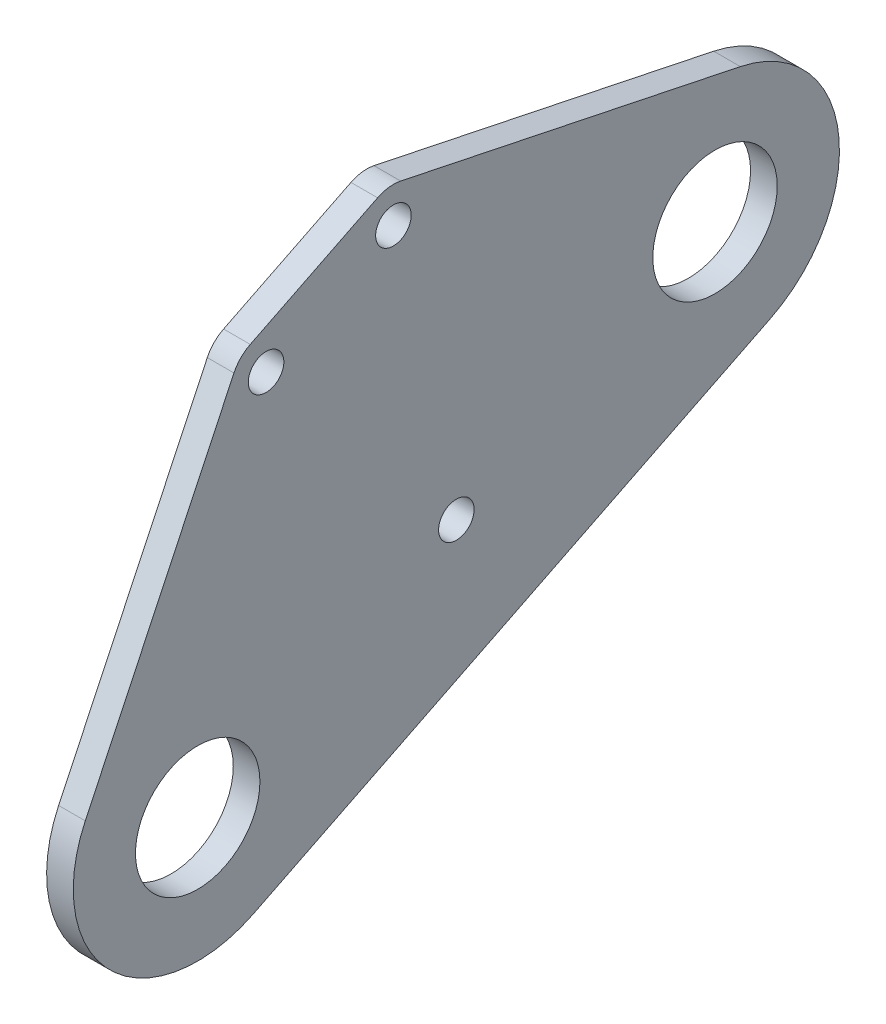
ISO-10303-21;
HEADER;
FILE_DESCRIPTION(('STEP AP214'),'2;1');
FILE_NAME('part.step','',(''),(''),'','','');
FILE_SCHEMA(('AUTOMOTIVE_DESIGN { 1 0 10303 214 1 1 1 1 }'));
ENDSEC;
DATA;
#1=APPLICATION_CONTEXT('core data for automotive mechanical design processes');
#2=APPLICATION_PROTOCOL_DEFINITION('international standard','automotive_design',2000,#1);
#3=PRODUCT_CONTEXT('',#1,'mechanical');
#4=PRODUCT('Part','Part','',(#3));
#5=PRODUCT_RELATED_PRODUCT_CATEGORY('part','',(#4));
#6=PRODUCT_DEFINITION_FORMATION('','',#4);
#7=PRODUCT_DEFINITION_CONTEXT('part definition',#1,'design');
#8=PRODUCT_DEFINITION('design','',#6,#7);
#9=PRODUCT_DEFINITION_SHAPE('','',#8);
#10=(LENGTH_UNIT() NAMED_UNIT(*) SI_UNIT(.MILLI.,.METRE.));
#11=(NAMED_UNIT(*) PLANE_ANGLE_UNIT() SI_UNIT($,.RADIAN.));
#12=(NAMED_UNIT(*) SI_UNIT($,.STERADIAN.) SOLID_ANGLE_UNIT());
#13=UNCERTAINTY_MEASURE_WITH_UNIT(LENGTH_MEASURE(1.E-05),#10,'distance_accuracy_value','');
#14=(GEOMETRIC_REPRESENTATION_CONTEXT(3) GLOBAL_UNCERTAINTY_ASSIGNED_CONTEXT((#13)) GLOBAL_UNIT_ASSIGNED_CONTEXT((#10,
#11,#12)) REPRESENTATION_CONTEXT('',''));
#15=CARTESIAN_POINT('',(0.,0.,0.));
#16=DIRECTION('',(0.,0.,1.));
#17=DIRECTION('',(1.,0.,0.));
#18=AXIS2_PLACEMENT_3D('',#15,#16,#17);
#19=CARTESIAN_POINT('',(3.,180.,382.2));
#20=DIRECTION('',(1.,0.,0.));
#21=DIRECTION('',(0.,0.,-1.));
#22=AXIS2_PLACEMENT_3D('',#19,#20,#21);
#23=PLANE('',#22);
#24=CARTESIAN_POINT('',(3.,197.747726212406,418.383811494776));
#25=DIRECTION('',(1.,0.,0.));
#26=DIRECTION('',(0.,0.,1.));
#27=AXIS2_PLACEMENT_3D('',#24,#25,#26);
#28=CIRCLE('',#27,1.99999999999982);
#29=CARTESIAN_POINT('',(3.,197.747726212406,420.383811494776));
#30=VERTEX_POINT('',#29);
#31=EDGE_CURVE('E204',#30,#30,#28,.T.);
#32=ORIENTED_EDGE('',*,*,#31,.F.);
#33=EDGE_LOOP('',(#32));
#34=FACE_BOUND('',#33,.T.);
#35=CARTESIAN_POINT('',(3.,180.,382.2));
#36=DIRECTION('',(1.,0.,0.));
#37=DIRECTION('',(0.,0.,-1.));
#38=AXIS2_PLACEMENT_3D('',#35,#36,#37);
#39=CIRCLE('',#38,6.99999999999993);
#40=CARTESIAN_POINT('',(3.,180.,375.2));
#41=VERTEX_POINT('',#40);
#42=EDGE_CURVE('E192',#41,#41,#39,.T.);
#43=ORIENTED_EDGE('',*,*,#42,.F.);
#44=EDGE_LOOP('',(#43));
#45=FACE_BOUND('',#44,.T.);
#46=CARTESIAN_POINT('',(3.,180.,382.2));
#47=DIRECTION('',(1.,0.,0.));
#48=DIRECTION('',(0.,0.,-1.));
#49=AXIS2_PLACEMENT_3D('',#46,#47,#48);
#50=CIRCLE('',#49,14.);
#51=CARTESIAN_POINT('',(3.,167.463734840162,375.967660484036));
#52=VERTEX_POINT('',#51);
#53=CARTESIAN_POINT('',(3.,193.706103559218,379.346453921174));
#54=VERTEX_POINT('',#53);
#55=EDGE_CURVE('E155',#52,#54,#50,.T.);
#56=ORIENTED_EDGE('',*,*,#55,.T.);
#57=DIRECTION('',(0.,0.203824719916136,0.979007397087023));
#58=VECTOR('',#57,1.);
#59=CARTESIAN_POINT('',(3.,201.663755800754,417.568512615111));
#60=LINE('',#59,#58);
#61=CARTESIAN_POINT('',(3.,201.663755800754,417.568512615111));
#62=VERTEX_POINT('',#61);
#63=EDGE_CURVE('E103',#54,#62,#60,.T.);
#64=ORIENTED_EDGE('',*,*,#63,.T.);
#65=CARTESIAN_POINT('',(3.,197.747726212406,418.383811494776));
#66=DIRECTION('',(1.,0.,0.));
#67=DIRECTION('',(0.,0.,-1.));
#68=AXIS2_PLACEMENT_3D('',#65,#66,#67);
#69=CIRCLE('',#68,3.99999999999999);
#70=CARTESIAN_POINT('',(3.,201.329516258074,420.164479927908));
#71=VERTEX_POINT('',#70);
#72=EDGE_CURVE('E170',#62,#71,#69,.T.);
#73=ORIENTED_EDGE('',*,*,#72,.T.);
#74=DIRECTION('',(0.,-0.445167108283126,0.895447511416967));
#75=VECTOR('',#74,1.);
#76=CARTESIAN_POINT('',(3.,194.206842525544,434.49164011058));
#77=LINE('',#76,#75);
#78=CARTESIAN_POINT('',(3.,194.206842525544,434.49164011058));
#79=VERTEX_POINT('',#78);
#80=EDGE_CURVE('E183',#71,#79,#77,.T.);
#81=ORIENTED_EDGE('',*,*,#80,.T.);
#82=CARTESIAN_POINT('',(3.,190.625052479876,432.710971677447));
#83=DIRECTION('',(1.,0.,0.));
#84=DIRECTION('',(0.,0.,-1.));
#85=AXIS2_PLACEMENT_3D('',#82,#83,#84);
#86=CIRCLE('',#85,3.99999999999999);
#87=CARTESIAN_POINT('',(3.,192.338978455997,436.325173905931));
#88=VERTEX_POINT('',#87);
#89=EDGE_CURVE('E122',#79,#88,#86,.T.);
#90=ORIENTED_EDGE('',*,*,#89,.T.);
#91=DIRECTION('',(0.,-0.903550557121012,0.42848149403015));
#92=VECTOR('',#91,1.);
#93=CARTESIAN_POINT('',(3.,192.338978455997,436.325173905931));
#94=LINE('',#93,#92);
#95=CARTESIAN_POINT('',(3.,157.062878878019,453.053796041797));
#96=VERTEX_POINT('',#95);
#97=EDGE_CURVE('E116',#88,#96,#94,.T.);
#98=ORIENTED_EDGE('',*,*,#97,.T.);
#99=CARTESIAN_POINT('',(3.,151.064137961596,440.404088242103));
#100=DIRECTION('',(1.,0.,0.));
#101=DIRECTION('',(0.,0.,-1.));
#102=AXIS2_PLACEMENT_3D('',#99,#100,#101);
#103=CIRCLE('',#102,14.0000000000001);
#104=CARTESIAN_POINT('',(3.,138.527872801759,434.171748726139));
#105=VERTEX_POINT('',#104);
#106=EDGE_CURVE('E120',#96,#105,#103,.T.);
#107=ORIENTED_EDGE('',*,*,#106,.T.);
#108=DIRECTION('',(0.,0.445167108283131,-0.895447511416965));
#109=VECTOR('',#108,1.);
#110=CARTESIAN_POINT('',(3.,167.463734840162,375.967660484036));
#111=LINE('',#110,#109);
#112=EDGE_CURVE('E60',#105,#52,#111,.T.);
#113=ORIENTED_EDGE('',*,*,#112,.T.);
#114=EDGE_LOOP('',(#56,#64,#73,#81,#90,#98,#107,#113));
#115=FACE_BOUND('',#114,.T.);
#116=CARTESIAN_POINT('',(3.,190.625052479876,432.710971677447));
#117=DIRECTION('',(1.,0.,0.));
#118=DIRECTION('',(0.,0.,-1.));
#119=AXIS2_PLACEMENT_3D('',#116,#117,#118);
#120=CIRCLE('',#119,1.99999999999982);
#121=CARTESIAN_POINT('',(3.,190.625052479876,430.710971677447));
#122=VERTEX_POINT('',#121);
#123=EDGE_CURVE('E144',#122,#122,#120,.T.);
#124=ORIENTED_EDGE('',*,*,#123,.F.);
#125=EDGE_LOOP('',(#124));
#126=FACE_BOUND('',#125,.T.);
#127=CARTESIAN_POINT('',(3.,151.064137961596,440.404088242103));
#128=DIRECTION('',(1.,0.,0.));
#129=DIRECTION('',(0.,0.,-1.));
#130=AXIS2_PLACEMENT_3D('',#127,#128,#129);
#131=CIRCLE('',#130,6.99999999999993);
#132=CARTESIAN_POINT('',(3.,151.064137961596,433.404088242103));
#133=VERTEX_POINT('',#132);
#134=EDGE_CURVE('E198',#133,#133,#131,.T.);
#135=ORIENTED_EDGE('',*,*,#134,.F.);
#136=EDGE_LOOP('',(#135));
#137=FACE_BOUND('',#136,.T.);
#138=CARTESIAN_POINT('',(3.,165.532068980798,411.302044121051));
#139=DIRECTION('',(1.,0.,0.));
#140=DIRECTION('',(0.,0.,-1.));
#141=AXIS2_PLACEMENT_3D('',#138,#139,#140);
#142=CIRCLE('',#141,1.99999999999982);
#143=CARTESIAN_POINT('',(3.,165.532068980798,409.302044121052));
#144=VERTEX_POINT('',#143);
#145=EDGE_CURVE('E210',#144,#144,#142,.T.);
#146=ORIENTED_EDGE('',*,*,#145,.F.);
#147=EDGE_LOOP('',(#146));
#148=FACE_BOUND('',#147,.T.);
#149=ADVANCED_FACE('F43',(#34,#45,#115,#126,#137,#148),#23,.T.);
#150=CARTESIAN_POINT('',(0.,180.,382.2));
#151=DIRECTION('',(1.,0.,0.));
#152=DIRECTION('',(0.,0.,-1.));
#153=AXIS2_PLACEMENT_3D('',#150,#151,#152);
#154=PLANE('',#153);
#155=CARTESIAN_POINT('',(0.,180.,382.2));
#156=DIRECTION('',(1.,0.,0.));
#157=DIRECTION('',(0.,0.,-1.));
#158=AXIS2_PLACEMENT_3D('',#155,#156,#157);
#159=CIRCLE('',#158,14.);
#160=CARTESIAN_POINT('',(0.,167.463734840162,375.967660484036));
#161=VERTEX_POINT('',#160);
#162=CARTESIAN_POINT('',(0.,193.706103559218,379.346453921174));
#163=VERTEX_POINT('',#162);
#164=EDGE_CURVE('E140',#161,#163,#159,.T.);
#165=ORIENTED_EDGE('',*,*,#164,.F.);
#166=DIRECTION('',(0.,0.445167108283131,-0.895447511416965));
#167=VECTOR('',#166,1.);
#168=CARTESIAN_POINT('',(0.,167.463734840162,375.967660484036));
#169=LINE('',#168,#167);
#170=CARTESIAN_POINT('',(0.,138.527872801759,434.171748726139));
#171=VERTEX_POINT('',#170);
#172=EDGE_CURVE('E95',#171,#161,#169,.T.);
#173=ORIENTED_EDGE('',*,*,#172,.F.);
#174=CARTESIAN_POINT('',(0.,151.064137961596,440.404088242103));
#175=DIRECTION('',(1.,0.,0.));
#176=DIRECTION('',(0.,0.,-1.));
#177=AXIS2_PLACEMENT_3D('',#174,#175,#176);
#178=CIRCLE('',#177,14.0000000000001);
#179=CARTESIAN_POINT('',(0.,157.062878878019,453.053796041797));
#180=VERTEX_POINT('',#179);
#181=EDGE_CURVE('E89',#180,#171,#178,.T.);
#182=ORIENTED_EDGE('',*,*,#181,.F.);
#183=DIRECTION('',(0.,-0.903550557121012,0.42848149403015));
#184=VECTOR('',#183,1.);
#185=CARTESIAN_POINT('',(0.,192.338978455997,436.325173905931));
#186=LINE('',#185,#184);
#187=CARTESIAN_POINT('',(0.,192.338978455997,436.325173905931));
#188=VERTEX_POINT('',#187);
#189=EDGE_CURVE('E130',#188,#180,#186,.T.);
#190=ORIENTED_EDGE('',*,*,#189,.F.);
#191=CARTESIAN_POINT('',(0.,190.625052479876,432.710971677447));
#192=DIRECTION('',(1.,0.,0.));
#193=DIRECTION('',(0.,0.,-1.));
#194=AXIS2_PLACEMENT_3D('',#191,#192,#193);
#195=CIRCLE('',#194,3.99999999999999);
#196=CARTESIAN_POINT('',(0.,194.206842525544,434.49164011058));
#197=VERTEX_POINT('',#196);
#198=EDGE_CURVE('E150',#197,#188,#195,.T.);
#199=ORIENTED_EDGE('',*,*,#198,.F.);
#200=DIRECTION('',(0.,-0.445167108283126,0.895447511416967));
#201=VECTOR('',#200,1.);
#202=CARTESIAN_POINT('',(0.,194.206842525544,434.49164011058));
#203=LINE('',#202,#201);
#204=CARTESIAN_POINT('',(0.,201.329516258074,420.164479927908));
#205=VERTEX_POINT('',#204);
#206=EDGE_CURVE('E148',#205,#197,#203,.T.);
#207=ORIENTED_EDGE('',*,*,#206,.F.);
#208=CARTESIAN_POINT('',(0.,197.747726212406,418.383811494776));
#209=DIRECTION('',(1.,0.,0.));
#210=DIRECTION('',(0.,0.,-1.));
#211=AXIS2_PLACEMENT_3D('',#208,#209,#210);
#212=CIRCLE('',#211,3.99999999999999);
#213=CARTESIAN_POINT('',(0.,201.663755800754,417.568512615111));
#214=VERTEX_POINT('',#213);
#215=EDGE_CURVE('E146',#214,#205,#212,.T.);
#216=ORIENTED_EDGE('',*,*,#215,.F.);
#217=DIRECTION('',(0.,0.203824719916136,0.979007397087023));
#218=VECTOR('',#217,1.);
#219=CARTESIAN_POINT('',(0.,201.663755800754,417.568512615111));
#220=LINE('',#219,#218);
#221=EDGE_CURVE('E143',#163,#214,#220,.T.);
#222=ORIENTED_EDGE('',*,*,#221,.F.);
#223=EDGE_LOOP('',(#165,#173,#182,#190,#199,#207,#216,#222));
#224=FACE_BOUND('',#223,.T.);
#225=CARTESIAN_POINT('',(0.,190.625052479876,432.710971677447));
#226=DIRECTION('',(1.,0.,0.));
#227=DIRECTION('',(0.,0.,-1.));
#228=AXIS2_PLACEMENT_3D('',#225,#226,#227);
#229=CIRCLE('',#228,1.99999999999982);
#230=CARTESIAN_POINT('',(0.,190.625052479876,430.710971677447));
#231=VERTEX_POINT('',#230);
#232=EDGE_CURVE('E189',#231,#231,#229,.T.);
#233=ORIENTED_EDGE('',*,*,#232,.T.);
#234=EDGE_LOOP('',(#233));
#235=FACE_BOUND('',#234,.T.);
#236=CARTESIAN_POINT('',(0.,180.,382.2));
#237=DIRECTION('',(1.,0.,0.));
#238=DIRECTION('',(0.,0.,-1.));
#239=AXIS2_PLACEMENT_3D('',#236,#237,#238);
#240=CIRCLE('',#239,6.99999999999993);
#241=CARTESIAN_POINT('',(0.,180.,375.2));
#242=VERTEX_POINT('',#241);
#243=EDGE_CURVE('E195',#242,#242,#240,.T.);
#244=ORIENTED_EDGE('',*,*,#243,.T.);
#245=EDGE_LOOP('',(#244));
#246=FACE_BOUND('',#245,.T.);
#247=CARTESIAN_POINT('',(0.,151.064137961596,440.404088242103));
#248=DIRECTION('',(1.,0.,0.));
#249=DIRECTION('',(0.,0.,-1.));
#250=AXIS2_PLACEMENT_3D('',#247,#248,#249);
#251=CIRCLE('',#250,6.99999999999993);
#252=CARTESIAN_POINT('',(0.,151.064137961596,433.404088242103));
#253=VERTEX_POINT('',#252);
#254=EDGE_CURVE('E201',#253,#253,#251,.T.);
#255=ORIENTED_EDGE('',*,*,#254,.T.);
#256=EDGE_LOOP('',(#255));
#257=FACE_BOUND('',#256,.T.);
#258=CARTESIAN_POINT('',(0.,197.747726212406,418.383811494776));
#259=DIRECTION('',(1.,0.,0.));
#260=DIRECTION('',(0.,0.,1.));
#261=AXIS2_PLACEMENT_3D('',#258,#259,#260);
#262=CIRCLE('',#261,1.99999999999982);
#263=CARTESIAN_POINT('',(0.,197.747726212406,420.383811494776));
#264=VERTEX_POINT('',#263);
#265=EDGE_CURVE('E207',#264,#264,#262,.T.);
#266=ORIENTED_EDGE('',*,*,#265,.T.);
#267=EDGE_LOOP('',(#266));
#268=FACE_BOUND('',#267,.T.);
#269=CARTESIAN_POINT('',(0.,165.532068980798,411.302044121051));
#270=DIRECTION('',(1.,0.,0.));
#271=DIRECTION('',(0.,0.,-1.));
#272=AXIS2_PLACEMENT_3D('',#269,#270,#271);
#273=CIRCLE('',#272,1.99999999999982);
#274=CARTESIAN_POINT('',(0.,165.532068980798,409.302044121052));
#275=VERTEX_POINT('',#274);
#276=EDGE_CURVE('E213',#275,#275,#273,.T.);
#277=ORIENTED_EDGE('',*,*,#276,.T.);
#278=EDGE_LOOP('',(#277));
#279=FACE_BOUND('',#278,.T.);
#280=ADVANCED_FACE('F174',(#224,#235,#246,#257,#268,#279),#154,.F.);
#281=CARTESIAN_POINT('',(3.,180.,382.2));
#282=DIRECTION('',(-1.,0.,0.));
#283=DIRECTION('',(0.,0.,1.));
#284=AXIS2_PLACEMENT_3D('',#281,#282,#283);
#285=CYLINDRICAL_SURFACE('',#284,14.);
#286=ORIENTED_EDGE('',*,*,#164,.T.);
#287=DIRECTION('',(-1.,0.,0.));
#288=VECTOR('',#287,1.);
#289=CARTESIAN_POINT('',(3.,193.706103559218,379.346453921174));
#290=LINE('',#289,#288);
#291=EDGE_CURVE('E11',#54,#163,#290,.T.);
#292=ORIENTED_EDGE('',*,*,#291,.F.);
#293=ORIENTED_EDGE('',*,*,#55,.F.);
#294=DIRECTION('',(-1.,0.,0.));
#295=VECTOR('',#294,1.);
#296=CARTESIAN_POINT('',(3.,167.463734840162,375.967660484036));
#297=LINE('',#296,#295);
#298=EDGE_CURVE('E136',#52,#161,#297,.T.);
#299=ORIENTED_EDGE('',*,*,#298,.T.);
#300=EDGE_LOOP('',(#286,#292,#293,#299));
#301=FACE_BOUND('',#300,.T.);
#302=ADVANCED_FACE('F45',(#301),#285,.T.);
#303=CARTESIAN_POINT('',(3.,201.663755800754,417.568512615111));
#304=DIRECTION('',(0.,-0.979007397087023,0.203824719916136));
#305=DIRECTION('',(0.,-0.203824719916136,-0.979007397087023));
#306=AXIS2_PLACEMENT_3D('',#303,#304,#305);
#307=PLANE('',#306);
#308=ORIENTED_EDGE('',*,*,#221,.T.);
#309=DIRECTION('',(-1.,0.,0.));
#310=VECTOR('',#309,1.);
#311=CARTESIAN_POINT('',(3.,201.663755800754,417.568512615111));
#312=LINE('',#311,#310);
#313=EDGE_CURVE('E52',#62,#214,#312,.T.);
#314=ORIENTED_EDGE('',*,*,#313,.F.);
#315=ORIENTED_EDGE('',*,*,#63,.F.);
#316=ORIENTED_EDGE('',*,*,#291,.T.);
#317=EDGE_LOOP('',(#308,#314,#315,#316));
#318=FACE_BOUND('',#317,.T.);
#319=ADVANCED_FACE('F247',(#318),#307,.F.);
#320=CARTESIAN_POINT('',(3.,197.747726212406,418.383811494776));
#321=DIRECTION('',(-1.,0.,0.));
#322=DIRECTION('',(0.,0.,1.));
#323=AXIS2_PLACEMENT_3D('',#320,#321,#322);
#324=CYLINDRICAL_SURFACE('',#323,3.99999999999999);
#325=ORIENTED_EDGE('',*,*,#215,.T.);
#326=DIRECTION('',(-1.,0.,0.));
#327=VECTOR('',#326,1.);
#328=CARTESIAN_POINT('',(3.,201.329516258074,420.164479927908));
#329=LINE('',#328,#327);
#330=EDGE_CURVE('E162',#71,#205,#329,.T.);
#331=ORIENTED_EDGE('',*,*,#330,.F.);
#332=ORIENTED_EDGE('',*,*,#72,.F.);
#333=ORIENTED_EDGE('',*,*,#313,.T.);
#334=EDGE_LOOP('',(#325,#331,#332,#333));
#335=FACE_BOUND('',#334,.T.);
#336=ADVANCED_FACE('F168',(#335),#324,.T.);
#337=CARTESIAN_POINT('',(3.,194.206842525544,434.49164011058));
#338=DIRECTION('',(0.,-0.895447511416967,-0.445167108283126));
#339=DIRECTION('',(0.,0.445167108283126,-0.895447511416967));
#340=AXIS2_PLACEMENT_3D('',#337,#338,#339);
#341=PLANE('',#340);
#342=ORIENTED_EDGE('',*,*,#206,.T.);
#343=DIRECTION('',(-1.,0.,0.));
#344=VECTOR('',#343,1.);
#345=CARTESIAN_POINT('',(3.,194.206842525544,434.49164011058));
#346=LINE('',#345,#344);
#347=EDGE_CURVE('E159',#79,#197,#346,.T.);
#348=ORIENTED_EDGE('',*,*,#347,.F.);
#349=ORIENTED_EDGE('',*,*,#80,.F.);
#350=ORIENTED_EDGE('',*,*,#330,.T.);
#351=EDGE_LOOP('',(#342,#348,#349,#350));
#352=FACE_BOUND('',#351,.T.);
#353=ADVANCED_FACE('F179',(#352),#341,.F.);
#354=CARTESIAN_POINT('',(3.,190.625052479876,432.710971677447));
#355=DIRECTION('',(-1.,0.,0.));
#356=DIRECTION('',(0.,0.,1.));
#357=AXIS2_PLACEMENT_3D('',#354,#355,#356);
#358=CYLINDRICAL_SURFACE('',#357,3.99999999999999);
#359=ORIENTED_EDGE('',*,*,#198,.T.);
#360=DIRECTION('',(-1.,0.,0.));
#361=VECTOR('',#360,1.);
#362=CARTESIAN_POINT('',(3.,192.338978455997,436.325173905931));
#363=LINE('',#362,#361);
#364=EDGE_CURVE('E131',#88,#188,#363,.T.);
#365=ORIENTED_EDGE('',*,*,#364,.F.);
#366=ORIENTED_EDGE('',*,*,#89,.F.);
#367=ORIENTED_EDGE('',*,*,#347,.T.);
#368=EDGE_LOOP('',(#359,#365,#366,#367));
#369=FACE_BOUND('',#368,.T.);
#370=ADVANCED_FACE('F182',(#369),#358,.T.);
#371=CARTESIAN_POINT('',(3.,192.338978455997,436.325173905931));
#372=DIRECTION('',(0.,-0.42848149403015,-0.903550557121012));
#373=DIRECTION('',(0.,0.903550557121012,-0.42848149403015));
#374=AXIS2_PLACEMENT_3D('',#371,#372,#373);
#375=PLANE('',#374);
#376=ORIENTED_EDGE('',*,*,#189,.T.);
#377=DIRECTION('',(-1.,0.,0.));
#378=VECTOR('',#377,1.);
#379=CARTESIAN_POINT('',(3.,157.062878878019,453.053796041797));
#380=LINE('',#379,#378);
#381=EDGE_CURVE('E127',#96,#180,#380,.T.);
#382=ORIENTED_EDGE('',*,*,#381,.F.);
#383=ORIENTED_EDGE('',*,*,#97,.F.);
#384=ORIENTED_EDGE('',*,*,#364,.T.);
#385=EDGE_LOOP('',(#376,#382,#383,#384));
#386=FACE_BOUND('',#385,.T.);
#387=ADVANCED_FACE('F128',(#386),#375,.F.);
#388=CARTESIAN_POINT('',(3.,151.064137961596,440.404088242103));
#389=DIRECTION('',(-1.,0.,0.));
#390=DIRECTION('',(0.,0.,1.));
#391=AXIS2_PLACEMENT_3D('',#388,#389,#390);
#392=CYLINDRICAL_SURFACE('',#391,14.0000000000001);
#393=ORIENTED_EDGE('',*,*,#181,.T.);
#394=DIRECTION('',(-1.,0.,0.));
#395=VECTOR('',#394,1.);
#396=CARTESIAN_POINT('',(3.,138.527872801759,434.171748726139));
#397=LINE('',#396,#395);
#398=EDGE_CURVE('E132',#105,#171,#397,.T.);
#399=ORIENTED_EDGE('',*,*,#398,.F.);
#400=ORIENTED_EDGE('',*,*,#106,.F.);
#401=ORIENTED_EDGE('',*,*,#381,.T.);
#402=EDGE_LOOP('',(#393,#399,#400,#401));
#403=FACE_BOUND('',#402,.T.);
#404=ADVANCED_FACE('F134',(#403),#392,.T.);
#405=CARTESIAN_POINT('',(3.,167.463734840162,375.967660484036));
#406=DIRECTION('',(0.,0.895447511416965,0.44516710828313));
#407=DIRECTION('',(0.,-0.445167108283131,0.895447511416965));
#408=AXIS2_PLACEMENT_3D('',#405,#406,#407);
#409=PLANE('',#408);
#410=ORIENTED_EDGE('',*,*,#172,.T.);
#411=ORIENTED_EDGE('',*,*,#298,.F.);
#412=ORIENTED_EDGE('',*,*,#112,.F.);
#413=ORIENTED_EDGE('',*,*,#398,.T.);
#414=EDGE_LOOP('',(#410,#411,#412,#413));
#415=FACE_BOUND('',#414,.T.);
#416=ADVANCED_FACE('F235',(#415),#409,.F.);
#417=CARTESIAN_POINT('',(3.,190.625052479876,432.710971677447));
#418=DIRECTION('',(-1.,0.,0.));
#419=DIRECTION('',(0.,0.,1.));
#420=AXIS2_PLACEMENT_3D('',#417,#418,#419);
#421=CYLINDRICAL_SURFACE('',#420,1.99999999999982);
#422=ORIENTED_EDGE('',*,*,#123,.T.);
#423=EDGE_LOOP('',(#422));
#424=FACE_BOUND('',#423,.T.);
#425=ORIENTED_EDGE('',*,*,#232,.F.);
#426=EDGE_LOOP('',(#425));
#427=FACE_BOUND('',#426,.T.);
#428=ADVANCED_FACE('F232',(#424,#427),#421,.F.);
#429=CARTESIAN_POINT('',(3.,180.,382.2));
#430=DIRECTION('',(-1.,0.,0.));
#431=DIRECTION('',(0.,0.,1.));
#432=AXIS2_PLACEMENT_3D('',#429,#430,#431);
#433=CYLINDRICAL_SURFACE('',#432,6.99999999999993);
#434=ORIENTED_EDGE('',*,*,#42,.T.);
#435=EDGE_LOOP('',(#434));
#436=FACE_BOUND('',#435,.T.);
#437=ORIENTED_EDGE('',*,*,#243,.F.);
#438=EDGE_LOOP('',(#437));
#439=FACE_BOUND('',#438,.T.);
#440=ADVANCED_FACE('F314',(#436,#439),#433,.F.);
#441=CARTESIAN_POINT('',(3.,151.064137961596,440.404088242103));
#442=DIRECTION('',(-1.,0.,0.));
#443=DIRECTION('',(0.,0.,1.));
#444=AXIS2_PLACEMENT_3D('',#441,#442,#443);
#445=CYLINDRICAL_SURFACE('',#444,6.99999999999993);
#446=ORIENTED_EDGE('',*,*,#134,.T.);
#447=EDGE_LOOP('',(#446));
#448=FACE_BOUND('',#447,.T.);
#449=ORIENTED_EDGE('',*,*,#254,.F.);
#450=EDGE_LOOP('',(#449));
#451=FACE_BOUND('',#450,.T.);
#452=ADVANCED_FACE('F322',(#448,#451),#445,.F.);
#453=CARTESIAN_POINT('',(3.,197.747726212406,418.383811494776));
#454=DIRECTION('',(-1.,0.,0.));
#455=DIRECTION('',(0.,0.,1.));
#456=AXIS2_PLACEMENT_3D('',#453,#454,#455);
#457=CYLINDRICAL_SURFACE('',#456,1.99999999999982);
#458=ORIENTED_EDGE('',*,*,#31,.T.);
#459=EDGE_LOOP('',(#458));
#460=FACE_BOUND('',#459,.T.);
#461=ORIENTED_EDGE('',*,*,#265,.F.);
#462=EDGE_LOOP('',(#461));
#463=FACE_BOUND('',#462,.T.);
#464=ADVANCED_FACE('F330',(#460,#463),#457,.F.);
#465=CARTESIAN_POINT('',(3.,165.532068980798,411.302044121051));
#466=DIRECTION('',(-1.,0.,0.));
#467=DIRECTION('',(0.,0.,1.));
#468=AXIS2_PLACEMENT_3D('',#465,#466,#467);
#469=CYLINDRICAL_SURFACE('',#468,1.99999999999982);
#470=ORIENTED_EDGE('',*,*,#145,.T.);
#471=EDGE_LOOP('',(#470));
#472=FACE_BOUND('',#471,.T.);
#473=ORIENTED_EDGE('',*,*,#276,.F.);
#474=EDGE_LOOP('',(#473));
#475=FACE_BOUND('',#474,.T.);
#476=ADVANCED_FACE('F219',(#472,#475),#469,.F.);
#477=CLOSED_SHELL('',(#149,#280,#302,#319,#336,#353,#370,#387,#404,#416,#428,#440,#452,#464,#476));
#478=MANIFOLD_SOLID_BREP('B2',#477);
#479=ADVANCED_BREP_SHAPE_REPRESENTATION('',(#18,#478),#14);
#480=SHAPE_DEFINITION_REPRESENTATION(#9,#479);
ENDSEC;
END-ISO-10303-21;
